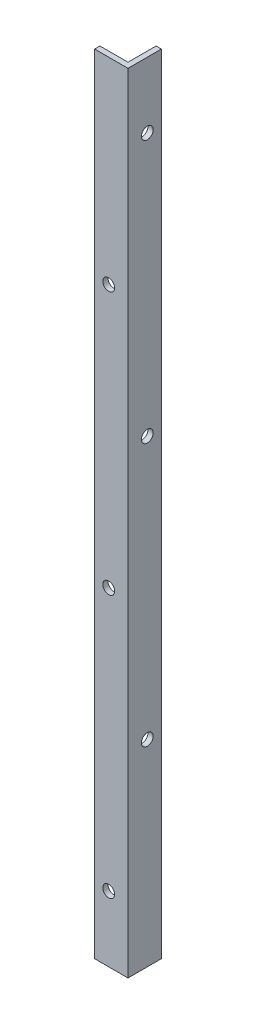
ISO-10303-21;
HEADER;
FILE_DESCRIPTION(('STEP AP214'),'2;1');
FILE_NAME('part.step','',(''),(''),'','','');
FILE_SCHEMA(('AUTOMOTIVE_DESIGN { 1 0 10303 214 1 1 1 1 }'));
ENDSEC;
DATA;
#1=APPLICATION_CONTEXT('core data for automotive mechanical design processes');
#2=APPLICATION_PROTOCOL_DEFINITION('international standard','automotive_design',2000,#1);
#3=PRODUCT_CONTEXT('',#1,'mechanical');
#4=PRODUCT('Part','Part','',(#3));
#5=PRODUCT_RELATED_PRODUCT_CATEGORY('part','',(#4));
#6=PRODUCT_DEFINITION_FORMATION('','',#4);
#7=PRODUCT_DEFINITION_CONTEXT('part definition',#1,'design');
#8=PRODUCT_DEFINITION('design','',#6,#7);
#9=PRODUCT_DEFINITION_SHAPE('','',#8);
#10=(LENGTH_UNIT() NAMED_UNIT(*) SI_UNIT(.MILLI.,.METRE.));
#11=(NAMED_UNIT(*) PLANE_ANGLE_UNIT() SI_UNIT($,.RADIAN.));
#12=(NAMED_UNIT(*) SI_UNIT($,.STERADIAN.) SOLID_ANGLE_UNIT());
#13=UNCERTAINTY_MEASURE_WITH_UNIT(LENGTH_MEASURE(1.E-05),#10,'distance_accuracy_value','');
#14=(GEOMETRIC_REPRESENTATION_CONTEXT(3) GLOBAL_UNCERTAINTY_ASSIGNED_CONTEXT((#13)) GLOBAL_UNIT_ASSIGNED_CONTEXT((#10,
#11,#12)) REPRESENTATION_CONTEXT('',''));
#15=CARTESIAN_POINT('',(0.,0.,0.));
#16=DIRECTION('',(0.,0.,1.));
#17=DIRECTION('',(1.,0.,0.));
#18=AXIS2_PLACEMENT_3D('',#15,#16,#17);
#19=CARTESIAN_POINT('',(0.,300.,-2.));
#20=DIRECTION('',(0.,0.,1.));
#21=DIRECTION('',(1.,0.,0.));
#22=AXIS2_PLACEMENT_3D('',#19,#20,#21);
#23=PLANE('',#22);
#24=CARTESIAN_POINT('',(-7.35000000000001,225.,-2.));
#25=DIRECTION('',(0.,0.,-1.));
#26=DIRECTION('',(-1.,0.,0.));
#27=AXIS2_PLACEMENT_3D('',#24,#25,#26);
#28=CIRCLE('',#27,2.25);
#29=CARTESIAN_POINT('',(-9.60000000000001,225.,-2.));
#30=VERTEX_POINT('',#29);
#31=EDGE_CURVE('E149',#30,#30,#28,.T.);
#32=ORIENTED_EDGE('',*,*,#31,.F.);
#33=EDGE_LOOP('',(#32));
#34=FACE_BOUND('',#33,.T.);
#35=CARTESIAN_POINT('',(-7.35000000000001,125.,-2.));
#36=DIRECTION('',(0.,0.,-1.));
#37=DIRECTION('',(-1.,0.,0.));
#38=AXIS2_PLACEMENT_3D('',#35,#36,#37);
#39=CIRCLE('',#38,2.25);
#40=CARTESIAN_POINT('',(-9.60000000000001,125.,-2.));
#41=VERTEX_POINT('',#40);
#42=EDGE_CURVE('E206',#41,#41,#39,.T.);
#43=ORIENTED_EDGE('',*,*,#42,.F.);
#44=EDGE_LOOP('',(#43));
#45=FACE_BOUND('',#44,.T.);
#46=CARTESIAN_POINT('',(-7.35000000000001,25.,-2.));
#47=DIRECTION('',(0.,0.,-1.));
#48=DIRECTION('',(-1.,0.,0.));
#49=AXIS2_PLACEMENT_3D('',#46,#47,#48);
#50=CIRCLE('',#49,2.25);
#51=CARTESIAN_POINT('',(-9.60000000000001,25.,-2.));
#52=VERTEX_POINT('',#51);
#53=EDGE_CURVE('E209',#52,#52,#50,.T.);
#54=ORIENTED_EDGE('',*,*,#53,.F.);
#55=EDGE_LOOP('',(#54));
#56=FACE_BOUND('',#55,.T.);
#57=DIRECTION('',(-1.,0.,0.));
#58=VECTOR('',#57,1.);
#59=CARTESIAN_POINT('',(0.,0.,-2.));
#60=LINE('',#59,#58);
#61=CARTESIAN_POINT('',(-2.,0.,-2.));
#62=VERTEX_POINT('',#61);
#63=CARTESIAN_POINT('',(-12.7,0.,-2.));
#64=VERTEX_POINT('',#63);
#65=EDGE_CURVE('E126',#62,#64,#60,.T.);
#66=ORIENTED_EDGE('',*,*,#65,.T.);
#67=DIRECTION('',(0.,-1.,0.));
#68=VECTOR('',#67,1.);
#69=CARTESIAN_POINT('',(-12.7,300.,-2.));
#70=LINE('',#69,#68);
#71=CARTESIAN_POINT('',(-12.7,300.,-2.));
#72=VERTEX_POINT('',#71);
#73=EDGE_CURVE('E11',#72,#64,#70,.T.);
#74=ORIENTED_EDGE('',*,*,#73,.F.);
#75=DIRECTION('',(-1.,0.,0.));
#76=VECTOR('',#75,1.);
#77=CARTESIAN_POINT('',(0.,300.,-2.));
#78=LINE('',#77,#76);
#79=CARTESIAN_POINT('',(-2.,300.,-2.));
#80=VERTEX_POINT('',#79);
#81=EDGE_CURVE('E141',#80,#72,#78,.T.);
#82=ORIENTED_EDGE('',*,*,#81,.F.);
#83=DIRECTION('',(0.,-1.,0.));
#84=VECTOR('',#83,1.);
#85=CARTESIAN_POINT('',(-2.,300.,-2.));
#86=LINE('',#85,#84);
#87=EDGE_CURVE('E58',#80,#62,#86,.T.);
#88=ORIENTED_EDGE('',*,*,#87,.T.);
#89=EDGE_LOOP('',(#66,#74,#82,#88));
#90=FACE_BOUND('',#89,.T.);
#91=ADVANCED_FACE('F40',(#34,#45,#56,#90),#23,.F.);
#92=CARTESIAN_POINT('',(-12.7,300.,0.));
#93=DIRECTION('',(1.,0.,0.));
#94=DIRECTION('',(0.,0.,-1.));
#95=AXIS2_PLACEMENT_3D('',#92,#93,#94);
#96=PLANE('',#95);
#97=DIRECTION('',(0.,0.,1.));
#98=VECTOR('',#97,1.);
#99=CARTESIAN_POINT('',(-12.7,0.,0.));
#100=LINE('',#99,#98);
#101=CARTESIAN_POINT('',(-12.7,0.,0.));
#102=VERTEX_POINT('',#101);
#103=EDGE_CURVE('E128',#64,#102,#100,.T.);
#104=ORIENTED_EDGE('',*,*,#103,.T.);
#105=DIRECTION('',(0.,-1.,0.));
#106=VECTOR('',#105,1.);
#107=CARTESIAN_POINT('',(-12.7,300.,0.));
#108=LINE('',#107,#106);
#109=CARTESIAN_POINT('',(-12.7,300.,0.));
#110=VERTEX_POINT('',#109);
#111=EDGE_CURVE('E49',#110,#102,#108,.T.);
#112=ORIENTED_EDGE('',*,*,#111,.F.);
#113=DIRECTION('',(0.,0.,1.));
#114=VECTOR('',#113,1.);
#115=CARTESIAN_POINT('',(-12.7,300.,0.));
#116=LINE('',#115,#114);
#117=EDGE_CURVE('E90',#72,#110,#116,.T.);
#118=ORIENTED_EDGE('',*,*,#117,.F.);
#119=ORIENTED_EDGE('',*,*,#73,.T.);
#120=EDGE_LOOP('',(#104,#112,#118,#119));
#121=FACE_BOUND('',#120,.T.);
#122=ADVANCED_FACE('F195',(#121),#96,.F.);
#123=CARTESIAN_POINT('',(0.,300.,0.));
#124=DIRECTION('',(0.,0.,1.));
#125=DIRECTION('',(1.,0.,0.));
#126=AXIS2_PLACEMENT_3D('',#123,#124,#125);
#127=PLANE('',#126);
#128=CARTESIAN_POINT('',(-7.35000000000001,225.,0.));
#129=DIRECTION('',(0.,0.,1.));
#130=DIRECTION('',(1.,0.,0.));
#131=AXIS2_PLACEMENT_3D('',#128,#129,#130);
#132=CIRCLE('',#131,2.25);
#133=CARTESIAN_POINT('',(-5.10000000000001,225.,0.));
#134=VERTEX_POINT('',#133);
#135=EDGE_CURVE('E43',#134,#134,#132,.T.);
#136=ORIENTED_EDGE('',*,*,#135,.F.);
#137=EDGE_LOOP('',(#136));
#138=FACE_BOUND('',#137,.T.);
#139=CARTESIAN_POINT('',(-7.35000000000001,125.,0.));
#140=DIRECTION('',(0.,0.,1.));
#141=DIRECTION('',(1.,0.,0.));
#142=AXIS2_PLACEMENT_3D('',#139,#140,#141);
#143=CIRCLE('',#142,2.25);
#144=CARTESIAN_POINT('',(-5.10000000000001,125.,0.));
#145=VERTEX_POINT('',#144);
#146=EDGE_CURVE('E148',#145,#145,#143,.T.);
#147=ORIENTED_EDGE('',*,*,#146,.F.);
#148=EDGE_LOOP('',(#147));
#149=FACE_BOUND('',#148,.T.);
#150=CARTESIAN_POINT('',(-7.35000000000001,25.,0.));
#151=DIRECTION('',(0.,0.,1.));
#152=DIRECTION('',(1.,0.,0.));
#153=AXIS2_PLACEMENT_3D('',#150,#151,#152);
#154=CIRCLE('',#153,2.25);
#155=CARTESIAN_POINT('',(-5.10000000000001,25.,0.));
#156=VERTEX_POINT('',#155);
#157=EDGE_CURVE('E146',#156,#156,#154,.T.);
#158=ORIENTED_EDGE('',*,*,#157,.F.);
#159=EDGE_LOOP('',(#158));
#160=FACE_BOUND('',#159,.T.);
#161=DIRECTION('',(-1.,0.,0.));
#162=VECTOR('',#161,1.);
#163=CARTESIAN_POINT('',(0.,0.,0.));
#164=LINE('',#163,#162);
#165=CARTESIAN_POINT('',(0.,0.,0.));
#166=VERTEX_POINT('',#165);
#167=EDGE_CURVE('E132',#166,#102,#164,.T.);
#168=ORIENTED_EDGE('',*,*,#167,.F.);
#169=DIRECTION('',(0.,-1.,0.));
#170=VECTOR('',#169,1.);
#171=CARTESIAN_POINT('',(0.,300.,0.));
#172=LINE('',#171,#170);
#173=CARTESIAN_POINT('',(0.,300.,0.));
#174=VERTEX_POINT('',#173);
#175=EDGE_CURVE('E118',#174,#166,#172,.T.);
#176=ORIENTED_EDGE('',*,*,#175,.F.);
#177=DIRECTION('',(-1.,0.,0.));
#178=VECTOR('',#177,1.);
#179=CARTESIAN_POINT('',(0.,300.,0.));
#180=LINE('',#179,#178);
#181=EDGE_CURVE('E108',#174,#110,#180,.T.);
#182=ORIENTED_EDGE('',*,*,#181,.T.);
#183=ORIENTED_EDGE('',*,*,#111,.T.);
#184=EDGE_LOOP('',(#168,#176,#182,#183));
#185=FACE_BOUND('',#184,.T.);
#186=ADVANCED_FACE('F178',(#138,#149,#160,#185),#127,.T.);
#187=CARTESIAN_POINT('',(0.,300.,0.));
#188=DIRECTION('',(-1.,0.,0.));
#189=DIRECTION('',(0.,0.,1.));
#190=AXIS2_PLACEMENT_3D('',#187,#188,#189);
#191=PLANE('',#190);
#192=CARTESIAN_POINT('',(0.,275.,-7.35));
#193=DIRECTION('',(-1.,0.,0.));
#194=DIRECTION('',(0.,0.,1.));
#195=AXIS2_PLACEMENT_3D('',#192,#193,#194);
#196=CIRCLE('',#195,2.25);
#197=CARTESIAN_POINT('',(0.,275.,-5.09999999999999));
#198=VERTEX_POINT('',#197);
#199=EDGE_CURVE('E129',#198,#198,#196,.T.);
#200=ORIENTED_EDGE('',*,*,#199,.T.);
#201=EDGE_LOOP('',(#200));
#202=FACE_BOUND('',#201,.T.);
#203=CARTESIAN_POINT('',(0.,175.,-7.35));
#204=DIRECTION('',(-1.,0.,0.));
#205=DIRECTION('',(0.,0.,1.));
#206=AXIS2_PLACEMENT_3D('',#203,#204,#205);
#207=CIRCLE('',#206,2.25);
#208=CARTESIAN_POINT('',(0.,175.,-5.09999999999999));
#209=VERTEX_POINT('',#208);
#210=EDGE_CURVE('E170',#209,#209,#207,.T.);
#211=ORIENTED_EDGE('',*,*,#210,.T.);
#212=EDGE_LOOP('',(#211));
#213=FACE_BOUND('',#212,.T.);
#214=CARTESIAN_POINT('',(0.,75.,-7.35));
#215=DIRECTION('',(-1.,0.,0.));
#216=DIRECTION('',(0.,0.,1.));
#217=AXIS2_PLACEMENT_3D('',#214,#215,#216);
#218=CIRCLE('',#217,2.25);
#219=CARTESIAN_POINT('',(0.,75.,-5.09999999999999));
#220=VERTEX_POINT('',#219);
#221=EDGE_CURVE('E167',#220,#220,#218,.T.);
#222=ORIENTED_EDGE('',*,*,#221,.T.);
#223=EDGE_LOOP('',(#222));
#224=FACE_BOUND('',#223,.T.);
#225=DIRECTION('',(0.,0.,-1.));
#226=VECTOR('',#225,1.);
#227=CARTESIAN_POINT('',(0.,0.,0.));
#228=LINE('',#227,#226);
#229=CARTESIAN_POINT('',(0.,0.,-12.7));
#230=VERTEX_POINT('',#229);
#231=EDGE_CURVE('E115',#166,#230,#228,.T.);
#232=ORIENTED_EDGE('',*,*,#231,.T.);
#233=DIRECTION('',(0.,-1.,0.));
#234=VECTOR('',#233,1.);
#235=CARTESIAN_POINT('',(0.,300.,-12.7));
#236=LINE('',#235,#234);
#237=CARTESIAN_POINT('',(0.,300.,-12.7));
#238=VERTEX_POINT('',#237);
#239=EDGE_CURVE('E112',#238,#230,#236,.T.);
#240=ORIENTED_EDGE('',*,*,#239,.F.);
#241=DIRECTION('',(0.,0.,-1.));
#242=VECTOR('',#241,1.);
#243=CARTESIAN_POINT('',(0.,300.,0.));
#244=LINE('',#243,#242);
#245=EDGE_CURVE('E101',#174,#238,#244,.T.);
#246=ORIENTED_EDGE('',*,*,#245,.F.);
#247=ORIENTED_EDGE('',*,*,#175,.T.);
#248=EDGE_LOOP('',(#232,#240,#246,#247));
#249=FACE_BOUND('',#248,.T.);
#250=ADVANCED_FACE('F113',(#202,#213,#224,#249),#191,.F.);
#251=CARTESIAN_POINT('',(0.,300.,-12.7));
#252=DIRECTION('',(0.,0.,-1.));
#253=DIRECTION('',(-1.,0.,0.));
#254=AXIS2_PLACEMENT_3D('',#251,#252,#253);
#255=PLANE('',#254);
#256=DIRECTION('',(1.,0.,0.));
#257=VECTOR('',#256,1.);
#258=CARTESIAN_POINT('',(0.,0.,-12.7));
#259=LINE('',#258,#257);
#260=CARTESIAN_POINT('',(-2.,0.,-12.7));
#261=VERTEX_POINT('',#260);
#262=EDGE_CURVE('E136',#261,#230,#259,.T.);
#263=ORIENTED_EDGE('',*,*,#262,.F.);
#264=DIRECTION('',(0.,-1.,0.));
#265=VECTOR('',#264,1.);
#266=CARTESIAN_POINT('',(-2.,300.,-12.7));
#267=LINE('',#266,#265);
#268=CARTESIAN_POINT('',(-2.,300.,-12.7));
#269=VERTEX_POINT('',#268);
#270=EDGE_CURVE('E78',#269,#261,#267,.T.);
#271=ORIENTED_EDGE('',*,*,#270,.F.);
#272=DIRECTION('',(1.,0.,0.));
#273=VECTOR('',#272,1.);
#274=CARTESIAN_POINT('',(0.,300.,-12.7));
#275=LINE('',#274,#273);
#276=EDGE_CURVE('E106',#269,#238,#275,.T.);
#277=ORIENTED_EDGE('',*,*,#276,.T.);
#278=ORIENTED_EDGE('',*,*,#239,.T.);
#279=EDGE_LOOP('',(#263,#271,#277,#278));
#280=FACE_BOUND('',#279,.T.);
#281=ADVANCED_FACE('F120',(#280),#255,.T.);
#282=CARTESIAN_POINT('',(-2.,300.,0.));
#283=DIRECTION('',(-1.,0.,0.));
#284=DIRECTION('',(0.,0.,1.));
#285=AXIS2_PLACEMENT_3D('',#282,#283,#284);
#286=PLANE('',#285);
#287=CARTESIAN_POINT('',(-2.,275.,-7.35));
#288=DIRECTION('',(-1.,0.,0.));
#289=DIRECTION('',(0.,0.,1.));
#290=AXIS2_PLACEMENT_3D('',#287,#288,#289);
#291=CIRCLE('',#290,2.25);
#292=CARTESIAN_POINT('',(-2.,275.,-5.09999999999999));
#293=VERTEX_POINT('',#292);
#294=EDGE_CURVE('E163',#293,#293,#291,.T.);
#295=ORIENTED_EDGE('',*,*,#294,.F.);
#296=EDGE_LOOP('',(#295));
#297=FACE_BOUND('',#296,.T.);
#298=CARTESIAN_POINT('',(-2.,175.,-7.35));
#299=DIRECTION('',(-1.,0.,0.));
#300=DIRECTION('',(0.,0.,1.));
#301=AXIS2_PLACEMENT_3D('',#298,#299,#300);
#302=CIRCLE('',#301,2.25);
#303=CARTESIAN_POINT('',(-2.,175.,-5.09999999999999));
#304=VERTEX_POINT('',#303);
#305=EDGE_CURVE('E158',#304,#304,#302,.T.);
#306=ORIENTED_EDGE('',*,*,#305,.F.);
#307=EDGE_LOOP('',(#306));
#308=FACE_BOUND('',#307,.T.);
#309=CARTESIAN_POINT('',(-2.,75.,-7.35));
#310=DIRECTION('',(-1.,0.,0.));
#311=DIRECTION('',(0.,0.,1.));
#312=AXIS2_PLACEMENT_3D('',#309,#310,#311);
#313=CIRCLE('',#312,2.25);
#314=CARTESIAN_POINT('',(-2.,75.,-5.09999999999999));
#315=VERTEX_POINT('',#314);
#316=EDGE_CURVE('E154',#315,#315,#313,.T.);
#317=ORIENTED_EDGE('',*,*,#316,.F.);
#318=EDGE_LOOP('',(#317));
#319=FACE_BOUND('',#318,.T.);
#320=DIRECTION('',(0.,0.,-1.));
#321=VECTOR('',#320,1.);
#322=CARTESIAN_POINT('',(-2.,0.,0.));
#323=LINE('',#322,#321);
#324=EDGE_CURVE('E138',#62,#261,#323,.T.);
#325=ORIENTED_EDGE('',*,*,#324,.F.);
#326=ORIENTED_EDGE('',*,*,#87,.F.);
#327=DIRECTION('',(0.,0.,-1.));
#328=VECTOR('',#327,1.);
#329=CARTESIAN_POINT('',(-2.,300.,0.));
#330=LINE('',#329,#328);
#331=EDGE_CURVE('E121',#80,#269,#330,.T.);
#332=ORIENTED_EDGE('',*,*,#331,.T.);
#333=ORIENTED_EDGE('',*,*,#270,.T.);
#334=EDGE_LOOP('',(#325,#326,#332,#333));
#335=FACE_BOUND('',#334,.T.);
#336=ADVANCED_FACE('F181',(#297,#308,#319,#335),#286,.T.);
#337=CARTESIAN_POINT('',(0.,300.,0.));
#338=DIRECTION('',(0.,1.,0.));
#339=DIRECTION('',(0.,0.,1.));
#340=AXIS2_PLACEMENT_3D('',#337,#338,#339);
#341=PLANE('',#340);
#342=ORIENTED_EDGE('',*,*,#81,.T.);
#343=ORIENTED_EDGE('',*,*,#117,.T.);
#344=ORIENTED_EDGE('',*,*,#181,.F.);
#345=ORIENTED_EDGE('',*,*,#245,.T.);
#346=ORIENTED_EDGE('',*,*,#276,.F.);
#347=ORIENTED_EDGE('',*,*,#331,.F.);
#348=EDGE_LOOP('',(#342,#343,#344,#345,#346,#347));
#349=FACE_BOUND('',#348,.T.);
#350=ADVANCED_FACE('F103',(#349),#341,.T.);
#351=CARTESIAN_POINT('',(0.,0.,0.));
#352=DIRECTION('',(0.,1.,0.));
#353=DIRECTION('',(0.,0.,1.));
#354=AXIS2_PLACEMENT_3D('',#351,#352,#353);
#355=PLANE('',#354);
#356=ORIENTED_EDGE('',*,*,#65,.F.);
#357=ORIENTED_EDGE('',*,*,#324,.T.);
#358=ORIENTED_EDGE('',*,*,#262,.T.);
#359=ORIENTED_EDGE('',*,*,#231,.F.);
#360=ORIENTED_EDGE('',*,*,#167,.T.);
#361=ORIENTED_EDGE('',*,*,#103,.F.);
#362=EDGE_LOOP('',(#356,#357,#358,#359,#360,#361));
#363=FACE_BOUND('',#362,.T.);
#364=ADVANCED_FACE('F180',(#363),#355,.F.);
#365=CARTESIAN_POINT('',(8.,75.,-7.35));
#366=DIRECTION('',(-1.,0.,0.));
#367=DIRECTION('',(0.,0.,1.));
#368=AXIS2_PLACEMENT_3D('',#365,#366,#367);
#369=CYLINDRICAL_SURFACE('',#368,2.25);
#370=ORIENTED_EDGE('',*,*,#316,.T.);
#371=EDGE_LOOP('',(#370));
#372=FACE_BOUND('',#371,.T.);
#373=ORIENTED_EDGE('',*,*,#221,.F.);
#374=EDGE_LOOP('',(#373));
#375=FACE_BOUND('',#374,.T.);
#376=ADVANCED_FACE('F232',(#372,#375),#369,.F.);
#377=CARTESIAN_POINT('',(8.,175.,-7.35));
#378=DIRECTION('',(-1.,0.,0.));
#379=DIRECTION('',(0.,0.,1.));
#380=AXIS2_PLACEMENT_3D('',#377,#378,#379);
#381=CYLINDRICAL_SURFACE('',#380,2.25);
#382=ORIENTED_EDGE('',*,*,#305,.T.);
#383=EDGE_LOOP('',(#382));
#384=FACE_BOUND('',#383,.T.);
#385=ORIENTED_EDGE('',*,*,#210,.F.);
#386=EDGE_LOOP('',(#385));
#387=FACE_BOUND('',#386,.T.);
#388=ADVANCED_FACE('F221',(#384,#387),#381,.F.);
#389=CARTESIAN_POINT('',(8.,275.,-7.35));
#390=DIRECTION('',(-1.,0.,0.));
#391=DIRECTION('',(0.,0.,1.));
#392=AXIS2_PLACEMENT_3D('',#389,#390,#391);
#393=CYLINDRICAL_SURFACE('',#392,2.25);
#394=ORIENTED_EDGE('',*,*,#294,.T.);
#395=EDGE_LOOP('',(#394));
#396=FACE_BOUND('',#395,.T.);
#397=ORIENTED_EDGE('',*,*,#199,.F.);
#398=EDGE_LOOP('',(#397));
#399=FACE_BOUND('',#398,.T.);
#400=ADVANCED_FACE('F217',(#396,#399),#393,.F.);
#401=CARTESIAN_POINT('',(-7.35000000000001,25.,8.));
#402=DIRECTION('',(0.,0.,-1.));
#403=DIRECTION('',(-1.,0.,0.));
#404=AXIS2_PLACEMENT_3D('',#401,#402,#403);
#405=CYLINDRICAL_SURFACE('',#404,2.25);
#406=ORIENTED_EDGE('',*,*,#157,.T.);
#407=EDGE_LOOP('',(#406));
#408=FACE_BOUND('',#407,.T.);
#409=ORIENTED_EDGE('',*,*,#53,.T.);
#410=EDGE_LOOP('',(#409));
#411=FACE_BOUND('',#410,.T.);
#412=ADVANCED_FACE('F220',(#408,#411),#405,.F.);
#413=CARTESIAN_POINT('',(-7.35000000000001,125.,8.));
#414=DIRECTION('',(0.,0.,-1.));
#415=DIRECTION('',(-1.,0.,0.));
#416=AXIS2_PLACEMENT_3D('',#413,#414,#415);
#417=CYLINDRICAL_SURFACE('',#416,2.25);
#418=ORIENTED_EDGE('',*,*,#146,.T.);
#419=EDGE_LOOP('',(#418));
#420=FACE_BOUND('',#419,.T.);
#421=ORIENTED_EDGE('',*,*,#42,.T.);
#422=EDGE_LOOP('',(#421));
#423=FACE_BOUND('',#422,.T.);
#424=ADVANCED_FACE('F244',(#420,#423),#417,.F.);
#425=CARTESIAN_POINT('',(-7.35000000000001,225.,8.));
#426=DIRECTION('',(0.,0.,-1.));
#427=DIRECTION('',(-1.,0.,0.));
#428=AXIS2_PLACEMENT_3D('',#425,#426,#427);
#429=CYLINDRICAL_SURFACE('',#428,2.25);
#430=ORIENTED_EDGE('',*,*,#135,.T.);
#431=EDGE_LOOP('',(#430));
#432=FACE_BOUND('',#431,.T.);
#433=ORIENTED_EDGE('',*,*,#31,.T.);
#434=EDGE_LOOP('',(#433));
#435=FACE_BOUND('',#434,.T.);
#436=ADVANCED_FACE('F248',(#432,#435),#429,.F.);
#437=CLOSED_SHELL('',(#91,#122,#186,#250,#281,#336,#350,#364,#376,#388,#400,#412,#424,#436));
#438=MANIFOLD_SOLID_BREP('B2',#437);
#439=ADVANCED_BREP_SHAPE_REPRESENTATION('',(#18,#438),#14);
#440=SHAPE_DEFINITION_REPRESENTATION(#9,#439);
ENDSEC;
END-ISO-10303-21;
